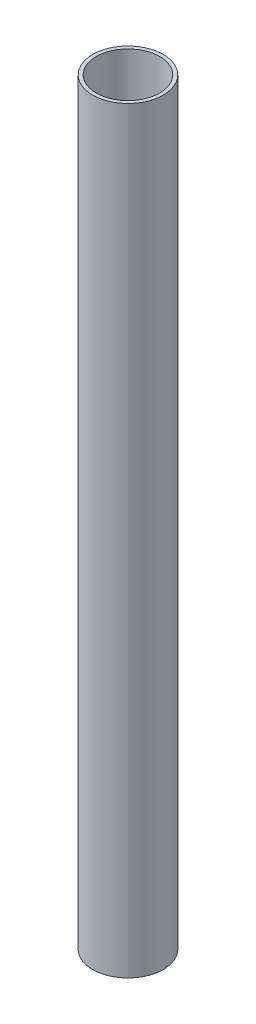
ISO-10303-21;
HEADER;
FILE_DESCRIPTION(('STEP AP214'),'2;1');
FILE_NAME('part.step','',(''),(''),'','','');
FILE_SCHEMA(('AUTOMOTIVE_DESIGN { 1 0 10303 214 1 1 1 1 }'));
ENDSEC;
DATA;
#1=APPLICATION_CONTEXT('core data for automotive mechanical design processes');
#2=APPLICATION_PROTOCOL_DEFINITION('international standard','automotive_design',2000,#1);
#3=PRODUCT_CONTEXT('',#1,'mechanical');
#4=PRODUCT('Part','Part','',(#3));
#5=PRODUCT_RELATED_PRODUCT_CATEGORY('part','',(#4));
#6=PRODUCT_DEFINITION_FORMATION('','',#4);
#7=PRODUCT_DEFINITION_CONTEXT('part definition',#1,'design');
#8=PRODUCT_DEFINITION('design','',#6,#7);
#9=PRODUCT_DEFINITION_SHAPE('','',#8);
#10=(LENGTH_UNIT() NAMED_UNIT(*) SI_UNIT(.MILLI.,.METRE.));
#11=(NAMED_UNIT(*) PLANE_ANGLE_UNIT() SI_UNIT($,.RADIAN.));
#12=(NAMED_UNIT(*) SI_UNIT($,.STERADIAN.) SOLID_ANGLE_UNIT());
#13=UNCERTAINTY_MEASURE_WITH_UNIT(LENGTH_MEASURE(1.E-05),#10,'distance_accuracy_value','');
#14=(GEOMETRIC_REPRESENTATION_CONTEXT(3) GLOBAL_UNCERTAINTY_ASSIGNED_CONTEXT((#13)) GLOBAL_UNIT_ASSIGNED_CONTEXT((#10,
#11,#12)) REPRESENTATION_CONTEXT('',''));
#15=CARTESIAN_POINT('',(0.,0.,0.));
#16=DIRECTION('',(0.,0.,1.));
#17=DIRECTION('',(1.,0.,0.));
#18=AXIS2_PLACEMENT_3D('',#15,#16,#17);
#19=CARTESIAN_POINT('',(0.,215.,0.));
#20=DIRECTION('',(0.,1.,0.));
#21=DIRECTION('',(0.,0.,1.));
#22=AXIS2_PLACEMENT_3D('',#19,#20,#21);
#23=PLANE('',#22);
#24=CARTESIAN_POINT('',(0.,215.,0.));
#25=DIRECTION('',(0.,1.,0.));
#26=DIRECTION('',(0.,0.,1.));
#27=AXIS2_PLACEMENT_3D('',#24,#25,#26);
#28=CIRCLE('',#27,10.);
#29=CARTESIAN_POINT('',(0.,215.,10.));
#30=VERTEX_POINT('',#29);
#31=EDGE_CURVE('E10',#30,#30,#28,.T.);
#32=ORIENTED_EDGE('',*,*,#31,.T.);
#33=EDGE_LOOP('',(#32));
#34=FACE_BOUND('',#33,.T.);
#35=CARTESIAN_POINT('',(0.,215.,0.));
#36=DIRECTION('',(0.,1.,0.));
#37=DIRECTION('',(0.,0.,1.));
#38=AXIS2_PLACEMENT_3D('',#35,#36,#37);
#39=CIRCLE('',#38,9.);
#40=CARTESIAN_POINT('',(0.,215.,9.));
#41=VERTEX_POINT('',#40);
#42=EDGE_CURVE('E44',#41,#41,#39,.T.);
#43=ORIENTED_EDGE('',*,*,#42,.F.);
#44=EDGE_LOOP('',(#43));
#45=FACE_BOUND('',#44,.T.);
#46=ADVANCED_FACE('F33',(#34,#45),#23,.T.);
#47=CARTESIAN_POINT('',(0.,0.,0.));
#48=DIRECTION('',(0.,1.,0.));
#49=DIRECTION('',(0.,0.,1.));
#50=AXIS2_PLACEMENT_3D('',#47,#48,#49);
#51=PLANE('',#50);
#52=CARTESIAN_POINT('',(0.,0.,0.));
#53=DIRECTION('',(0.,1.,0.));
#54=DIRECTION('',(0.,0.,1.));
#55=AXIS2_PLACEMENT_3D('',#52,#53,#54);
#56=CIRCLE('',#55,10.);
#57=CARTESIAN_POINT('',(0.,0.,10.));
#58=VERTEX_POINT('',#57);
#59=EDGE_CURVE('E37',#58,#58,#56,.T.);
#60=ORIENTED_EDGE('',*,*,#59,.F.);
#61=EDGE_LOOP('',(#60));
#62=FACE_BOUND('',#61,.T.);
#63=CARTESIAN_POINT('',(0.,0.,0.));
#64=DIRECTION('',(0.,1.,0.));
#65=DIRECTION('',(0.,0.,1.));
#66=AXIS2_PLACEMENT_3D('',#63,#64,#65);
#67=CIRCLE('',#66,9.);
#68=CARTESIAN_POINT('',(0.,0.,9.));
#69=VERTEX_POINT('',#68);
#70=EDGE_CURVE('E46',#69,#69,#67,.T.);
#71=ORIENTED_EDGE('',*,*,#70,.T.);
#72=EDGE_LOOP('',(#71));
#73=FACE_BOUND('',#72,.T.);
#74=ADVANCED_FACE('F56',(#62,#73),#51,.F.);
#75=CARTESIAN_POINT('',(0.,215.,0.));
#76=DIRECTION('',(0.,-1.,0.));
#77=DIRECTION('',(0.,0.,-1.));
#78=AXIS2_PLACEMENT_3D('',#75,#76,#77);
#79=CYLINDRICAL_SURFACE('',#78,10.);
#80=ORIENTED_EDGE('',*,*,#31,.F.);
#81=EDGE_LOOP('',(#80));
#82=FACE_BOUND('',#81,.T.);
#83=ORIENTED_EDGE('',*,*,#59,.T.);
#84=EDGE_LOOP('',(#83));
#85=FACE_BOUND('',#84,.T.);
#86=ADVANCED_FACE('F35',(#82,#85),#79,.T.);
#87=CARTESIAN_POINT('',(0.,215.,0.));
#88=DIRECTION('',(0.,-1.,0.));
#89=DIRECTION('',(0.,0.,-1.));
#90=AXIS2_PLACEMENT_3D('',#87,#88,#89);
#91=CYLINDRICAL_SURFACE('',#90,9.);
#92=ORIENTED_EDGE('',*,*,#42,.T.);
#93=EDGE_LOOP('',(#92));
#94=FACE_BOUND('',#93,.T.);
#95=ORIENTED_EDGE('',*,*,#70,.F.);
#96=EDGE_LOOP('',(#95));
#97=FACE_BOUND('',#96,.T.);
#98=ADVANCED_FACE('F52',(#94,#97),#91,.F.);
#99=CLOSED_SHELL('',(#46,#74,#86,#98));
#100=MANIFOLD_SOLID_BREP('B2',#99);
#101=ADVANCED_BREP_SHAPE_REPRESENTATION('',(#18,#100),#14);
#102=SHAPE_DEFINITION_REPRESENTATION(#9,#101);
ENDSEC;
END-ISO-10303-21;
